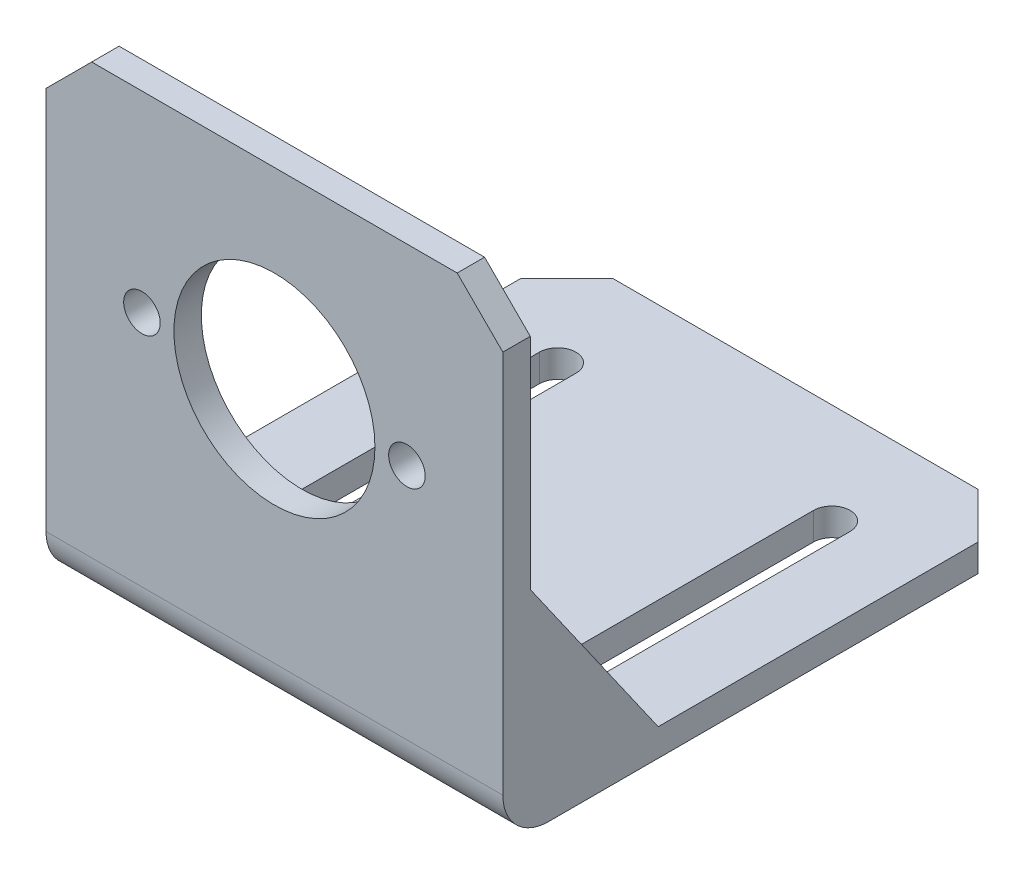
ISO-10303-21;
HEADER;
FILE_DESCRIPTION(('STEP AP214'),'2;1');
FILE_NAME('part.step','',(''),(''),'','','');
FILE_SCHEMA(('AUTOMOTIVE_DESIGN { 1 0 10303 214 1 1 1 1 }'));
ENDSEC;
DATA;
#1=APPLICATION_CONTEXT('core data for automotive mechanical design processes');
#2=APPLICATION_PROTOCOL_DEFINITION('international standard','automotive_design',2000,#1);
#3=PRODUCT_CONTEXT('',#1,'mechanical');
#4=PRODUCT('Part','Part','',(#3));
#5=PRODUCT_RELATED_PRODUCT_CATEGORY('part','',(#4));
#6=PRODUCT_DEFINITION_FORMATION('','',#4);
#7=PRODUCT_DEFINITION_CONTEXT('part definition',#1,'design');
#8=PRODUCT_DEFINITION('design','',#6,#7);
#9=PRODUCT_DEFINITION_SHAPE('','',#8);
#10=(LENGTH_UNIT() NAMED_UNIT(*) SI_UNIT(.MILLI.,.METRE.));
#11=(NAMED_UNIT(*) PLANE_ANGLE_UNIT() SI_UNIT($,.RADIAN.));
#12=(NAMED_UNIT(*) SI_UNIT($,.STERADIAN.) SOLID_ANGLE_UNIT());
#13=UNCERTAINTY_MEASURE_WITH_UNIT(LENGTH_MEASURE(1.E-05),#10,'distance_accuracy_value','');
#14=(GEOMETRIC_REPRESENTATION_CONTEXT(3) GLOBAL_UNCERTAINTY_ASSIGNED_CONTEXT((#13)) GLOBAL_UNIT_ASSIGNED_CONTEXT((#10,
#11,#12)) REPRESENTATION_CONTEXT('',''));
#15=CARTESIAN_POINT('',(0.,0.,0.));
#16=DIRECTION('',(0.,0.,1.));
#17=DIRECTION('',(1.,0.,0.));
#18=AXIS2_PLACEMENT_3D('',#15,#16,#17);
#19=CARTESIAN_POINT('',(-49.4131112314674,-3.,0.));
#20=DIRECTION('',(0.,0.573462344363328,-0.81923192051904));
#21=DIRECTION('',(0.,0.81923192051904,0.573462344363328));
#22=AXIS2_PLACEMENT_3D('',#19,#20,#21);
#23=PLANE('',#22);
#24=DIRECTION('',(1.,0.,0.));
#25=VECTOR('',#24,1.);
#26=CARTESIAN_POINT('',(-49.4131112314674,-3.,0.));
#27=LINE('',#26,#25);
#28=CARTESIAN_POINT('',(-25.,-3.,0.));
#29=VERTEX_POINT('',#28);
#30=CARTESIAN_POINT('',(-22.,-3.,0.));
#31=VERTEX_POINT('',#30);
#32=EDGE_CURVE('E222',#29,#31,#27,.T.);
#33=ORIENTED_EDGE('',*,*,#32,.T.);
#34=DIRECTION('',(0.,0.819231920519041,0.573462344363328));
#35=VECTOR('',#34,1.);
#36=CARTESIAN_POINT('',(-22.,-3.,0.));
#37=LINE('',#36,#35);
#38=CARTESIAN_POINT('',(-22.,-23.,-14.));
#39=VERTEX_POINT('',#38);
#40=EDGE_CURVE('E197',#39,#31,#37,.T.);
#41=ORIENTED_EDGE('',*,*,#40,.F.);
#42=DIRECTION('',(1.,0.,0.));
#43=VECTOR('',#42,1.);
#44=CARTESIAN_POINT('',(-49.4131112314674,-23.,-14.));
#45=LINE('',#44,#43);
#46=CARTESIAN_POINT('',(-25.,-23.,-14.));
#47=VERTEX_POINT('',#46);
#48=EDGE_CURVE('E204',#47,#39,#45,.T.);
#49=ORIENTED_EDGE('',*,*,#48,.F.);
#50=DIRECTION('',(0.,-0.81923192051904,-0.573462344363328));
#51=VECTOR('',#50,1.);
#52=CARTESIAN_POINT('',(-25.,-3.,0.));
#53=LINE('',#52,#51);
#54=EDGE_CURVE('E224',#29,#47,#53,.T.);
#55=ORIENTED_EDGE('',*,*,#54,.F.);
#56=EDGE_LOOP('',(#33,#41,#49,#55));
#57=FACE_BOUND('',#56,.T.);
#58=ADVANCED_FACE('F33',(#57),#23,.T.);
#59=CARTESIAN_POINT('',(0.,0.,0.));
#60=DIRECTION('',(0.,0.,1.));
#61=DIRECTION('',(1.,0.,0.));
#62=AXIS2_PLACEMENT_3D('',#59,#60,#61);
#63=PLANE('',#62);
#64=CARTESIAN_POINT('',(0.,5.,0.));
#65=DIRECTION('',(0.,0.,1.));
#66=DIRECTION('',(1.,0.,0.));
#67=AXIS2_PLACEMENT_3D('',#64,#65,#66);
#68=CIRCLE('',#67,11.);
#69=CARTESIAN_POINT('',(11.,5.,0.));
#70=VERTEX_POINT('',#69);
#71=EDGE_CURVE('E284',#70,#70,#68,.T.);
#72=ORIENTED_EDGE('',*,*,#71,.T.);
#73=EDGE_LOOP('',(#72));
#74=FACE_BOUND('',#73,.T.);
#75=CARTESIAN_POINT('',(14.5,5.,0.));
#76=DIRECTION('',(0.,0.,1.));
#77=DIRECTION('',(1.,0.,0.));
#78=AXIS2_PLACEMENT_3D('',#75,#76,#77);
#79=CIRCLE('',#78,2.);
#80=CARTESIAN_POINT('',(16.5,5.,0.));
#81=VERTEX_POINT('',#80);
#82=EDGE_CURVE('E278',#81,#81,#79,.T.);
#83=ORIENTED_EDGE('',*,*,#82,.T.);
#84=EDGE_LOOP('',(#83));
#85=FACE_BOUND('',#84,.T.);
#86=CARTESIAN_POINT('',(-14.5,5.,0.));
#87=DIRECTION('',(0.,0.,1.));
#88=DIRECTION('',(1.,0.,0.));
#89=AXIS2_PLACEMENT_3D('',#86,#87,#88);
#90=CIRCLE('',#89,2.);
#91=CARTESIAN_POINT('',(-12.5,5.,0.));
#92=VERTEX_POINT('',#91);
#93=EDGE_CURVE('E273',#92,#92,#90,.T.);
#94=ORIENTED_EDGE('',*,*,#93,.T.);
#95=EDGE_LOOP('',(#94));
#96=FACE_BOUND('',#95,.T.);
#97=DIRECTION('',(0.,1.,0.));
#98=VECTOR('',#97,1.);
#99=CARTESIAN_POINT('',(25.,26.,0.));
#100=LINE('',#99,#98);
#101=CARTESIAN_POINT('',(25.,-3.,0.));
#102=VERTEX_POINT('',#101);
#103=CARTESIAN_POINT('',(25.,21.,0.));
#104=VERTEX_POINT('',#103);
#105=EDGE_CURVE('E311',#102,#104,#100,.T.);
#106=ORIENTED_EDGE('',*,*,#105,.F.);
#107=CARTESIAN_POINT('',(22.,-3.,0.));
#108=VERTEX_POINT('',#107);
#109=EDGE_CURVE('E225',#108,#102,#27,.T.);
#110=ORIENTED_EDGE('',*,*,#109,.F.);
#111=DIRECTION('',(0.,-1.,0.));
#112=VECTOR('',#111,1.);
#113=CARTESIAN_POINT('',(22.,-23.,0.));
#114=LINE('',#113,#112);
#115=CARTESIAN_POINT('',(22.,-23.,0.));
#116=VERTEX_POINT('',#115);
#117=EDGE_CURVE('E193',#108,#116,#114,.T.);
#118=ORIENTED_EDGE('',*,*,#117,.T.);
#119=DIRECTION('',(1.,0.,0.));
#120=VECTOR('',#119,1.);
#121=CARTESIAN_POINT('',(-22.,-23.,0.));
#122=LINE('',#121,#120);
#123=CARTESIAN_POINT('',(-22.,-23.,0.));
#124=VERTEX_POINT('',#123);
#125=EDGE_CURVE('E185',#124,#116,#122,.T.);
#126=ORIENTED_EDGE('',*,*,#125,.F.);
#127=DIRECTION('',(0.,-1.,0.));
#128=VECTOR('',#127,1.);
#129=CARTESIAN_POINT('',(-22.,-23.,0.));
#130=LINE('',#129,#128);
#131=EDGE_CURVE('E190',#31,#124,#130,.T.);
#132=ORIENTED_EDGE('',*,*,#131,.F.);
#133=ORIENTED_EDGE('',*,*,#32,.F.);
#134=DIRECTION('',(0.,-1.,0.));
#135=VECTOR('',#134,1.);
#136=CARTESIAN_POINT('',(-25.,26.,0.));
#137=LINE('',#136,#135);
#138=CARTESIAN_POINT('',(-25.,21.,0.));
#139=VERTEX_POINT('',#138);
#140=EDGE_CURVE('E298',#139,#29,#137,.T.);
#141=ORIENTED_EDGE('',*,*,#140,.F.);
#142=DIRECTION('',(-0.707106781186549,-0.707106781186547,0.));
#143=VECTOR('',#142,1.);
#144=CARTESIAN_POINT('',(-25.,21.,0.));
#145=LINE('',#144,#143);
#146=CARTESIAN_POINT('',(-20.,26.,0.));
#147=VERTEX_POINT('',#146);
#148=EDGE_CURVE('E324',#139,#147,#145,.F.);
#149=ORIENTED_EDGE('',*,*,#148,.T.);
#150=DIRECTION('',(-1.,0.,0.));
#151=VECTOR('',#150,1.);
#152=CARTESIAN_POINT('',(-25.,26.,0.));
#153=LINE('',#152,#151);
#154=CARTESIAN_POINT('',(20.,26.,0.));
#155=VERTEX_POINT('',#154);
#156=EDGE_CURVE('E303',#155,#147,#153,.T.);
#157=ORIENTED_EDGE('',*,*,#156,.F.);
#158=DIRECTION('',(-0.707106781186547,0.707106781186549,0.));
#159=VECTOR('',#158,1.);
#160=CARTESIAN_POINT('',(20.,26.,0.));
#161=LINE('',#160,#159);
#162=EDGE_CURVE('E321',#155,#104,#161,.F.);
#163=ORIENTED_EDGE('',*,*,#162,.T.);
#164=EDGE_LOOP('',(#106,#110,#118,#126,#132,#133,#141,#149,#157,#163));
#165=FACE_BOUND('',#164,.T.);
#166=ADVANCED_FACE('F188',(#74,#85,#96,#165),#63,.F.);
#167=CARTESIAN_POINT('',(-25.,26.,3.));
#168=DIRECTION('',(1.,0.,0.));
#169=DIRECTION('',(0.,1.,0.));
#170=AXIS2_PLACEMENT_3D('',#167,#168,#169);
#171=PLANE('',#170);
#172=DIRECTION('',(0.,0.,-1.));
#173=VECTOR('',#172,1.);
#174=CARTESIAN_POINT('',(-25.,-26.,3.));
#175=LINE('',#174,#173);
#176=CARTESIAN_POINT('',(-25.,-26.,-2.));
#177=VERTEX_POINT('',#176);
#178=CARTESIAN_POINT('',(-25.,-26.,-49.));
#179=VERTEX_POINT('',#178);
#180=EDGE_CURVE('E316',#177,#179,#175,.T.);
#181=ORIENTED_EDGE('',*,*,#180,.F.);
#182=CARTESIAN_POINT('',(-25.,-21.,-2.));
#183=DIRECTION('',(1.,0.,0.));
#184=DIRECTION('',(0.,1.,0.));
#185=AXIS2_PLACEMENT_3D('',#182,#183,#184);
#186=CIRCLE('',#185,5.);
#187=CARTESIAN_POINT('',(-25.,-21.,3.));
#188=VERTEX_POINT('',#187);
#189=EDGE_CURVE('E11',#177,#188,#186,.F.);
#190=ORIENTED_EDGE('',*,*,#189,.T.);
#191=DIRECTION('',(0.,-1.,0.));
#192=VECTOR('',#191,1.);
#193=CARTESIAN_POINT('',(-25.,26.,3.));
#194=LINE('',#193,#192);
#195=CARTESIAN_POINT('',(-25.,21.,3.));
#196=VERTEX_POINT('',#195);
#197=EDGE_CURVE('E299',#196,#188,#194,.T.);
#198=ORIENTED_EDGE('',*,*,#197,.F.);
#199=DIRECTION('',(0.,0.,-1.));
#200=VECTOR('',#199,1.);
#201=CARTESIAN_POINT('',(-25.,21.,3.));
#202=LINE('',#201,#200);
#203=EDGE_CURVE('E318',#196,#139,#202,.T.);
#204=ORIENTED_EDGE('',*,*,#203,.T.);
#205=ORIENTED_EDGE('',*,*,#140,.T.);
#206=ORIENTED_EDGE('',*,*,#54,.T.);
#207=DIRECTION('',(0.,0.,1.));
#208=VECTOR('',#207,1.);
#209=CARTESIAN_POINT('',(-25.,-23.,-54.));
#210=LINE('',#209,#208);
#211=CARTESIAN_POINT('',(-25.,-23.,-49.));
#212=VERTEX_POINT('',#211);
#213=EDGE_CURVE('E296',#212,#47,#210,.T.);
#214=ORIENTED_EDGE('',*,*,#213,.F.);
#215=DIRECTION('',(0.,-1.,0.));
#216=VECTOR('',#215,1.);
#217=CARTESIAN_POINT('',(-25.,26.,-49.));
#218=LINE('',#217,#216);
#219=EDGE_CURVE('E348',#212,#179,#218,.T.);
#220=ORIENTED_EDGE('',*,*,#219,.T.);
#221=EDGE_LOOP('',(#181,#190,#198,#204,#205,#206,#214,#220));
#222=FACE_BOUND('',#221,.T.);
#223=ADVANCED_FACE('F401',(#222),#171,.F.);
#224=CARTESIAN_POINT('',(-25.,-26.,3.));
#225=DIRECTION('',(0.,1.,0.));
#226=DIRECTION('',(0.,0.,1.));
#227=AXIS2_PLACEMENT_3D('',#224,#225,#226);
#228=PLANE('',#227);
#229=DIRECTION('',(0.,0.,1.));
#230=VECTOR('',#229,1.);
#231=CARTESIAN_POINT('',(-13.,-26.,-43.));
#232=LINE('',#231,#230);
#233=CARTESIAN_POINT('',(-13.,-26.,-43.));
#234=VERTEX_POINT('',#233);
#235=CARTESIAN_POINT('',(-13.,-26.,-13.));
#236=VERTEX_POINT('',#235);
#237=EDGE_CURVE('E231',#234,#236,#232,.T.);
#238=ORIENTED_EDGE('',*,*,#237,.F.);
#239=CARTESIAN_POINT('',(-15.,-26.,-43.));
#240=DIRECTION('',(0.,-1.,0.));
#241=DIRECTION('',(0.,0.,1.));
#242=AXIS2_PLACEMENT_3D('',#239,#240,#241);
#243=CIRCLE('',#242,2.);
#244=CARTESIAN_POINT('',(-17.,-26.,-43.));
#245=VERTEX_POINT('',#244);
#246=EDGE_CURVE('E229',#245,#234,#243,.T.);
#247=ORIENTED_EDGE('',*,*,#246,.F.);
#248=DIRECTION('',(0.,0.,-1.));
#249=VECTOR('',#248,1.);
#250=CARTESIAN_POINT('',(-17.,-26.,-43.));
#251=LINE('',#250,#249);
#252=CARTESIAN_POINT('',(-17.,-26.,-13.));
#253=VERTEX_POINT('',#252);
#254=EDGE_CURVE('E237',#253,#245,#251,.T.);
#255=ORIENTED_EDGE('',*,*,#254,.F.);
#256=CARTESIAN_POINT('',(-15.,-26.,-13.));
#257=DIRECTION('',(0.,-1.,0.));
#258=DIRECTION('',(0.,0.,1.));
#259=AXIS2_PLACEMENT_3D('',#256,#257,#258);
#260=CIRCLE('',#259,2.);
#261=EDGE_CURVE('E234',#236,#253,#260,.T.);
#262=ORIENTED_EDGE('',*,*,#261,.F.);
#263=EDGE_LOOP('',(#238,#247,#255,#262));
#264=FACE_BOUND('',#263,.T.);
#265=DIRECTION('',(0.,0.,1.));
#266=VECTOR('',#265,1.);
#267=CARTESIAN_POINT('',(17.,-26.,-43.));
#268=LINE('',#267,#266);
#269=CARTESIAN_POINT('',(17.,-26.,-43.));
#270=VERTEX_POINT('',#269);
#271=CARTESIAN_POINT('',(17.,-26.,-13.));
#272=VERTEX_POINT('',#271);
#273=EDGE_CURVE('E251',#270,#272,#268,.T.);
#274=ORIENTED_EDGE('',*,*,#273,.F.);
#275=CARTESIAN_POINT('',(15.,-26.,-43.));
#276=DIRECTION('',(0.,-1.,0.));
#277=DIRECTION('',(0.,0.,-1.));
#278=AXIS2_PLACEMENT_3D('',#275,#276,#277);
#279=CIRCLE('',#278,2.);
#280=CARTESIAN_POINT('',(13.,-26.,-43.));
#281=VERTEX_POINT('',#280);
#282=EDGE_CURVE('E243',#281,#270,#279,.T.);
#283=ORIENTED_EDGE('',*,*,#282,.F.);
#284=DIRECTION('',(0.,0.,-1.));
#285=VECTOR('',#284,1.);
#286=CARTESIAN_POINT('',(13.,-26.,-43.));
#287=LINE('',#286,#285);
#288=CARTESIAN_POINT('',(13.,-26.,-13.));
#289=VERTEX_POINT('',#288);
#290=EDGE_CURVE('E257',#289,#281,#287,.T.);
#291=ORIENTED_EDGE('',*,*,#290,.F.);
#292=CARTESIAN_POINT('',(15.,-26.,-13.));
#293=DIRECTION('',(0.,-1.,0.));
#294=DIRECTION('',(0.,0.,-1.));
#295=AXIS2_PLACEMENT_3D('',#292,#293,#294);
#296=CIRCLE('',#295,2.);
#297=EDGE_CURVE('E254',#272,#289,#296,.T.);
#298=ORIENTED_EDGE('',*,*,#297,.F.);
#299=EDGE_LOOP('',(#274,#283,#291,#298));
#300=FACE_BOUND('',#299,.T.);
#301=DIRECTION('',(0.,0.,-1.));
#302=VECTOR('',#301,1.);
#303=CARTESIAN_POINT('',(25.,-26.,3.));
#304=LINE('',#303,#302);
#305=CARTESIAN_POINT('',(25.,-26.,-2.));
#306=VERTEX_POINT('',#305);
#307=CARTESIAN_POINT('',(25.,-26.,-49.));
#308=VERTEX_POINT('',#307);
#309=EDGE_CURVE('E308',#306,#308,#304,.T.);
#310=ORIENTED_EDGE('',*,*,#309,.F.);
#311=DIRECTION('',(1.,0.,0.));
#312=VECTOR('',#311,1.);
#313=CARTESIAN_POINT('',(-25.,-26.,-2.));
#314=LINE('',#313,#312);
#315=EDGE_CURVE('E41',#306,#177,#314,.F.);
#316=ORIENTED_EDGE('',*,*,#315,.T.);
#317=ORIENTED_EDGE('',*,*,#180,.T.);
#318=DIRECTION('',(-0.707106781186546,0.,0.707106781186549));
#319=VECTOR('',#318,1.);
#320=CARTESIAN_POINT('',(-20.,-26.,-54.));
#321=LINE('',#320,#319);
#322=CARTESIAN_POINT('',(-20.,-26.,-54.));
#323=VERTEX_POINT('',#322);
#324=EDGE_CURVE('E354',#179,#323,#321,.F.);
#325=ORIENTED_EDGE('',*,*,#324,.T.);
#326=DIRECTION('',(-1.,0.,0.));
#327=VECTOR('',#326,1.);
#328=CARTESIAN_POINT('',(25.,-26.,-54.));
#329=LINE('',#328,#327);
#330=CARTESIAN_POINT('',(20.,-26.,-54.));
#331=VERTEX_POINT('',#330);
#332=EDGE_CURVE('E287',#331,#323,#329,.T.);
#333=ORIENTED_EDGE('',*,*,#332,.F.);
#334=DIRECTION('',(-0.707106781186547,0.,-0.707106781186549));
#335=VECTOR('',#334,1.);
#336=CARTESIAN_POINT('',(20.,-26.,-54.));
#337=LINE('',#336,#335);
#338=EDGE_CURVE('E351',#331,#308,#337,.F.);
#339=ORIENTED_EDGE('',*,*,#338,.T.);
#340=EDGE_LOOP('',(#310,#316,#317,#325,#333,#339));
#341=FACE_BOUND('',#340,.T.);
#342=ADVANCED_FACE('F446',(#264,#300,#341),#228,.F.);
#343=CARTESIAN_POINT('',(25.,26.,3.));
#344=DIRECTION('',(-1.,0.,0.));
#345=DIRECTION('',(0.,0.,1.));
#346=AXIS2_PLACEMENT_3D('',#343,#344,#345);
#347=PLANE('',#346);
#348=DIRECTION('',(0.,1.,0.));
#349=VECTOR('',#348,1.);
#350=CARTESIAN_POINT('',(25.,26.,3.));
#351=LINE('',#350,#349);
#352=CARTESIAN_POINT('',(25.,-21.,3.));
#353=VERTEX_POINT('',#352);
#354=CARTESIAN_POINT('',(25.,21.,3.));
#355=VERTEX_POINT('',#354);
#356=EDGE_CURVE('E302',#353,#355,#351,.T.);
#357=ORIENTED_EDGE('',*,*,#356,.F.);
#358=CARTESIAN_POINT('',(25.,-21.,-2.));
#359=DIRECTION('',(-1.,0.,0.));
#360=DIRECTION('',(0.,0.,1.));
#361=AXIS2_PLACEMENT_3D('',#358,#359,#360);
#362=CIRCLE('',#361,5.);
#363=EDGE_CURVE('E55',#353,#306,#362,.F.);
#364=ORIENTED_EDGE('',*,*,#363,.T.);
#365=ORIENTED_EDGE('',*,*,#309,.T.);
#366=DIRECTION('',(0.,1.,0.));
#367=VECTOR('',#366,1.);
#368=CARTESIAN_POINT('',(25.,26.,-49.));
#369=LINE('',#368,#367);
#370=CARTESIAN_POINT('',(25.,-23.,-49.));
#371=VERTEX_POINT('',#370);
#372=EDGE_CURVE('E356',#308,#371,#369,.T.);
#373=ORIENTED_EDGE('',*,*,#372,.T.);
#374=DIRECTION('',(0.,0.,1.));
#375=VECTOR('',#374,1.);
#376=CARTESIAN_POINT('',(25.,-23.,-54.));
#377=LINE('',#376,#375);
#378=CARTESIAN_POINT('',(25.,-23.,-14.));
#379=VERTEX_POINT('',#378);
#380=EDGE_CURVE('E293',#371,#379,#377,.T.);
#381=ORIENTED_EDGE('',*,*,#380,.T.);
#382=DIRECTION('',(0.,0.81923192051904,0.573462344363328));
#383=VECTOR('',#382,1.);
#384=CARTESIAN_POINT('',(25.,-3.,0.));
#385=LINE('',#384,#383);
#386=EDGE_CURVE('E196',#379,#102,#385,.T.);
#387=ORIENTED_EDGE('',*,*,#386,.T.);
#388=ORIENTED_EDGE('',*,*,#105,.T.);
#389=DIRECTION('',(0.,0.,1.));
#390=VECTOR('',#389,1.);
#391=CARTESIAN_POINT('',(25.,21.,3.));
#392=LINE('',#391,#390);
#393=EDGE_CURVE('E335',#104,#355,#392,.T.);
#394=ORIENTED_EDGE('',*,*,#393,.T.);
#395=EDGE_LOOP('',(#357,#364,#365,#373,#381,#387,#388,#394));
#396=FACE_BOUND('',#395,.T.);
#397=ADVANCED_FACE('F385',(#396),#347,.F.);
#398=CARTESIAN_POINT('',(-25.,26.,3.));
#399=DIRECTION('',(0.,-1.,0.));
#400=DIRECTION('',(0.,0.,-1.));
#401=AXIS2_PLACEMENT_3D('',#398,#399,#400);
#402=PLANE('',#401);
#403=ORIENTED_EDGE('',*,*,#156,.T.);
#404=DIRECTION('',(0.,0.,1.));
#405=VECTOR('',#404,1.);
#406=CARTESIAN_POINT('',(-20.,26.,3.));
#407=LINE('',#406,#405);
#408=CARTESIAN_POINT('',(-20.,26.,3.));
#409=VERTEX_POINT('',#408);
#410=EDGE_CURVE('E329',#147,#409,#407,.T.);
#411=ORIENTED_EDGE('',*,*,#410,.T.);
#412=DIRECTION('',(-1.,0.,0.));
#413=VECTOR('',#412,1.);
#414=CARTESIAN_POINT('',(-25.,26.,3.));
#415=LINE('',#414,#413);
#416=CARTESIAN_POINT('',(20.,26.,3.));
#417=VERTEX_POINT('',#416);
#418=EDGE_CURVE('E305',#417,#409,#415,.T.);
#419=ORIENTED_EDGE('',*,*,#418,.F.);
#420=DIRECTION('',(0.,0.,-1.));
#421=VECTOR('',#420,1.);
#422=CARTESIAN_POINT('',(20.,26.,3.));
#423=LINE('',#422,#421);
#424=EDGE_CURVE('E326',#417,#155,#423,.T.);
#425=ORIENTED_EDGE('',*,*,#424,.T.);
#426=EDGE_LOOP('',(#403,#411,#419,#425));
#427=FACE_BOUND('',#426,.T.);
#428=ADVANCED_FACE('F394',(#427),#402,.F.);
#429=CARTESIAN_POINT('',(0.,0.,3.));
#430=DIRECTION('',(0.,0.,1.));
#431=DIRECTION('',(1.,0.,0.));
#432=AXIS2_PLACEMENT_3D('',#429,#430,#431);
#433=PLANE('',#432);
#434=CARTESIAN_POINT('',(14.5,5.,3.));
#435=DIRECTION('',(0.,0.,1.));
#436=DIRECTION('',(1.,0.,0.));
#437=AXIS2_PLACEMENT_3D('',#434,#435,#436);
#438=CIRCLE('',#437,2.);
#439=CARTESIAN_POINT('',(16.5,5.,3.));
#440=VERTEX_POINT('',#439);
#441=EDGE_CURVE('E270',#440,#440,#438,.T.);
#442=ORIENTED_EDGE('',*,*,#441,.F.);
#443=EDGE_LOOP('',(#442));
#444=FACE_BOUND('',#443,.T.);
#445=CARTESIAN_POINT('',(-14.5,5.,3.));
#446=DIRECTION('',(0.,0.,1.));
#447=DIRECTION('',(-1.,0.,0.));
#448=AXIS2_PLACEMENT_3D('',#445,#446,#447);
#449=CIRCLE('',#448,2.);
#450=CARTESIAN_POINT('',(-12.5,5.,3.));
#451=VERTEX_POINT('',#450);
#452=EDGE_CURVE('E263',#451,#451,#449,.T.);
#453=ORIENTED_EDGE('',*,*,#452,.F.);
#454=EDGE_LOOP('',(#453));
#455=FACE_BOUND('',#454,.T.);
#456=CARTESIAN_POINT('',(0.,5.,3.));
#457=DIRECTION('',(0.,0.,1.));
#458=DIRECTION('',(1.,0.,0.));
#459=AXIS2_PLACEMENT_3D('',#456,#457,#458);
#460=CIRCLE('',#459,11.);
#461=CARTESIAN_POINT('',(11.,5.,3.));
#462=VERTEX_POINT('',#461);
#463=EDGE_CURVE('E281',#462,#462,#460,.T.);
#464=ORIENTED_EDGE('',*,*,#463,.F.);
#465=EDGE_LOOP('',(#464));
#466=FACE_BOUND('',#465,.T.);
#467=ORIENTED_EDGE('',*,*,#197,.T.);
#468=DIRECTION('',(1.,0.,0.));
#469=VECTOR('',#468,1.);
#470=CARTESIAN_POINT('',(25.,-21.,3.));
#471=LINE('',#470,#469);
#472=EDGE_CURVE('E376',#188,#353,#471,.T.);
#473=ORIENTED_EDGE('',*,*,#472,.T.);
#474=ORIENTED_EDGE('',*,*,#356,.T.);
#475=DIRECTION('',(0.707106781186547,-0.707106781186549,0.));
#476=VECTOR('',#475,1.);
#477=CARTESIAN_POINT('',(23.,23.,3.));
#478=LINE('',#477,#476);
#479=EDGE_CURVE('E331',#355,#417,#478,.F.);
#480=ORIENTED_EDGE('',*,*,#479,.T.);
#481=ORIENTED_EDGE('',*,*,#418,.T.);
#482=DIRECTION('',(0.707106781186549,0.707106781186547,0.));
#483=VECTOR('',#482,1.);
#484=CARTESIAN_POINT('',(-23.,23.,3.));
#485=LINE('',#484,#483);
#486=EDGE_CURVE('E333',#409,#196,#485,.F.);
#487=ORIENTED_EDGE('',*,*,#486,.T.);
#488=EDGE_LOOP('',(#467,#473,#474,#480,#481,#487));
#489=FACE_BOUND('',#488,.T.);
#490=ADVANCED_FACE('F381',(#444,#455,#466,#489),#433,.T.);
#491=CARTESIAN_POINT('',(25.,-23.,-54.));
#492=DIRECTION('',(0.,-1.,0.));
#493=DIRECTION('',(1.,0.,0.));
#494=AXIS2_PLACEMENT_3D('',#491,#492,#493);
#495=PLANE('',#494);
#496=DIRECTION('',(0.,0.,-1.));
#497=VECTOR('',#496,1.);
#498=CARTESIAN_POINT('',(22.,-23.,-14.));
#499=LINE('',#498,#497);
#500=CARTESIAN_POINT('',(22.,-23.,-14.));
#501=VERTEX_POINT('',#500);
#502=EDGE_CURVE('E213',#116,#501,#499,.T.);
#503=ORIENTED_EDGE('',*,*,#502,.T.);
#504=EDGE_CURVE('E221',#501,#379,#45,.T.);
#505=ORIENTED_EDGE('',*,*,#504,.T.);
#506=ORIENTED_EDGE('',*,*,#380,.F.);
#507=DIRECTION('',(0.707106781186547,0.,0.707106781186549));
#508=VECTOR('',#507,1.);
#509=CARTESIAN_POINT('',(20.,-23.,-54.));
#510=LINE('',#509,#508);
#511=CARTESIAN_POINT('',(20.,-23.,-54.));
#512=VERTEX_POINT('',#511);
#513=EDGE_CURVE('E344',#371,#512,#510,.F.);
#514=ORIENTED_EDGE('',*,*,#513,.T.);
#515=DIRECTION('',(1.,0.,0.));
#516=VECTOR('',#515,1.);
#517=CARTESIAN_POINT('',(25.,-23.,-54.));
#518=LINE('',#517,#516);
#519=CARTESIAN_POINT('',(-20.,-23.,-54.));
#520=VERTEX_POINT('',#519);
#521=EDGE_CURVE('E290',#520,#512,#518,.T.);
#522=ORIENTED_EDGE('',*,*,#521,.F.);
#523=DIRECTION('',(0.707106781186546,0.,-0.707106781186549));
#524=VECTOR('',#523,1.);
#525=CARTESIAN_POINT('',(-20.,-23.,-54.));
#526=LINE('',#525,#524);
#527=EDGE_CURVE('E346',#520,#212,#526,.F.);
#528=ORIENTED_EDGE('',*,*,#527,.T.);
#529=ORIENTED_EDGE('',*,*,#213,.T.);
#530=ORIENTED_EDGE('',*,*,#48,.T.);
#531=DIRECTION('',(0.,0.,-1.));
#532=VECTOR('',#531,1.);
#533=CARTESIAN_POINT('',(-22.,-23.,-14.));
#534=LINE('',#533,#532);
#535=EDGE_CURVE('E200',#124,#39,#534,.T.);
#536=ORIENTED_EDGE('',*,*,#535,.F.);
#537=ORIENTED_EDGE('',*,*,#125,.T.);
#538=EDGE_LOOP('',(#503,#505,#506,#514,#522,#528,#529,#530,#536,#537));
#539=FACE_BOUND('',#538,.T.);
#540=DIRECTION('',(0.,0.,-1.));
#541=VECTOR('',#540,1.);
#542=CARTESIAN_POINT('',(13.,-23.,-54.));
#543=LINE('',#542,#541);
#544=CARTESIAN_POINT('',(13.,-23.,-13.));
#545=VERTEX_POINT('',#544);
#546=CARTESIAN_POINT('',(13.,-23.,-43.));
#547=VERTEX_POINT('',#546);
#548=EDGE_CURVE('E362',#545,#547,#543,.T.);
#549=ORIENTED_EDGE('',*,*,#548,.T.);
#550=CARTESIAN_POINT('',(15.,-23.,-43.));
#551=DIRECTION('',(0.,-1.,0.));
#552=DIRECTION('',(1.,0.,0.));
#553=AXIS2_PLACEMENT_3D('',#550,#551,#552);
#554=CIRCLE('',#553,2.);
#555=CARTESIAN_POINT('',(17.,-23.,-43.));
#556=VERTEX_POINT('',#555);
#557=EDGE_CURVE('E364',#547,#556,#554,.T.);
#558=ORIENTED_EDGE('',*,*,#557,.T.);
#559=DIRECTION('',(0.,0.,1.));
#560=VECTOR('',#559,1.);
#561=CARTESIAN_POINT('',(17.,-23.,-54.));
#562=LINE('',#561,#560);
#563=CARTESIAN_POINT('',(17.,-23.,-13.));
#564=VERTEX_POINT('',#563);
#565=EDGE_CURVE('E358',#556,#564,#562,.T.);
#566=ORIENTED_EDGE('',*,*,#565,.T.);
#567=CARTESIAN_POINT('',(15.,-23.,-13.));
#568=DIRECTION('',(0.,-1.,0.));
#569=DIRECTION('',(1.,0.,0.));
#570=AXIS2_PLACEMENT_3D('',#567,#568,#569);
#571=CIRCLE('',#570,2.);
#572=EDGE_CURVE('E360',#564,#545,#571,.T.);
#573=ORIENTED_EDGE('',*,*,#572,.T.);
#574=EDGE_LOOP('',(#549,#558,#566,#573));
#575=FACE_BOUND('',#574,.T.);
#576=DIRECTION('',(0.,0.,1.));
#577=VECTOR('',#576,1.);
#578=CARTESIAN_POINT('',(-13.,-23.,-54.));
#579=LINE('',#578,#577);
#580=CARTESIAN_POINT('',(-13.,-23.,-43.));
#581=VERTEX_POINT('',#580);
#582=CARTESIAN_POINT('',(-13.,-23.,-13.));
#583=VERTEX_POINT('',#582);
#584=EDGE_CURVE('E367',#581,#583,#579,.T.);
#585=ORIENTED_EDGE('',*,*,#584,.T.);
#586=CARTESIAN_POINT('',(-15.,-23.,-13.));
#587=DIRECTION('',(0.,-1.,0.));
#588=DIRECTION('',(1.,0.,0.));
#589=AXIS2_PLACEMENT_3D('',#586,#587,#588);
#590=CIRCLE('',#589,2.);
#591=CARTESIAN_POINT('',(-17.,-23.,-13.));
#592=VERTEX_POINT('',#591);
#593=EDGE_CURVE('E369',#583,#592,#590,.T.);
#594=ORIENTED_EDGE('',*,*,#593,.T.);
#595=DIRECTION('',(0.,0.,-1.));
#596=VECTOR('',#595,1.);
#597=CARTESIAN_POINT('',(-17.,-23.,-54.));
#598=LINE('',#597,#596);
#599=CARTESIAN_POINT('',(-17.,-23.,-43.));
#600=VERTEX_POINT('',#599);
#601=EDGE_CURVE('E371',#592,#600,#598,.T.);
#602=ORIENTED_EDGE('',*,*,#601,.T.);
#603=CARTESIAN_POINT('',(-15.,-23.,-43.));
#604=DIRECTION('',(0.,-1.,0.));
#605=DIRECTION('',(1.,0.,0.));
#606=AXIS2_PLACEMENT_3D('',#603,#604,#605);
#607=CIRCLE('',#606,2.);
#608=EDGE_CURVE('E373',#600,#581,#607,.T.);
#609=ORIENTED_EDGE('',*,*,#608,.T.);
#610=EDGE_LOOP('',(#585,#594,#602,#609));
#611=FACE_BOUND('',#610,.T.);
#612=ADVANCED_FACE('F201',(#539,#575,#611),#495,.F.);
#613=CARTESIAN_POINT('',(0.,0.,-54.));
#614=DIRECTION('',(0.,0.,1.));
#615=DIRECTION('',(1.,0.,0.));
#616=AXIS2_PLACEMENT_3D('',#613,#614,#615);
#617=PLANE('',#616);
#618=ORIENTED_EDGE('',*,*,#332,.T.);
#619=DIRECTION('',(0.,1.,0.));
#620=VECTOR('',#619,1.);
#621=CARTESIAN_POINT('',(-20.,0.,-54.));
#622=LINE('',#621,#620);
#623=EDGE_CURVE('E341',#323,#520,#622,.T.);
#624=ORIENTED_EDGE('',*,*,#623,.T.);
#625=ORIENTED_EDGE('',*,*,#521,.T.);
#626=DIRECTION('',(0.,-1.,0.));
#627=VECTOR('',#626,1.);
#628=CARTESIAN_POINT('',(20.,0.,-54.));
#629=LINE('',#628,#627);
#630=EDGE_CURVE('E338',#512,#331,#629,.T.);
#631=ORIENTED_EDGE('',*,*,#630,.T.);
#632=EDGE_LOOP('',(#618,#624,#625,#631));
#633=FACE_BOUND('',#632,.T.);
#634=ADVANCED_FACE('F444',(#633),#617,.F.);
#635=CARTESIAN_POINT('',(0.,5.,-54.));
#636=DIRECTION('',(0.,0.,1.));
#637=DIRECTION('',(1.,0.,0.));
#638=AXIS2_PLACEMENT_3D('',#635,#636,#637);
#639=CYLINDRICAL_SURFACE('',#638,11.);
#640=CARTESIAN_POINT('',(11.,5.,3.));
#641=CARTESIAN_POINT('',(11.,5.,2.96875));
#642=CARTESIAN_POINT('',(11.,5.,2.9375));
#643=CARTESIAN_POINT('',(11.,5.,2.875));
#644=CARTESIAN_POINT('',(11.,5.,2.84375));
#645=CARTESIAN_POINT('',(11.,5.,2.78125));
#646=CARTESIAN_POINT('',(11.,5.,2.75));
#647=CARTESIAN_POINT('',(11.,5.,2.6875));
#648=CARTESIAN_POINT('',(11.,5.,2.65625));
#649=CARTESIAN_POINT('',(11.,5.,2.59375));
#650=CARTESIAN_POINT('',(11.,5.,2.5625));
#651=CARTESIAN_POINT('',(11.,5.,2.5));
#652=CARTESIAN_POINT('',(11.,5.,2.46875));
#653=CARTESIAN_POINT('',(11.,5.,2.40625));
#654=CARTESIAN_POINT('',(11.,5.,2.375));
#655=CARTESIAN_POINT('',(11.,5.,2.3125));
#656=CARTESIAN_POINT('',(11.,5.,2.28125));
#657=CARTESIAN_POINT('',(11.,5.,2.21875));
#658=CARTESIAN_POINT('',(11.,5.,2.1875));
#659=CARTESIAN_POINT('',(11.,5.,2.125));
#660=CARTESIAN_POINT('',(11.,5.,2.09375));
#661=CARTESIAN_POINT('',(11.,5.,2.03125));
#662=CARTESIAN_POINT('',(11.,5.,2.));
#663=CARTESIAN_POINT('',(11.,5.,1.9375));
#664=CARTESIAN_POINT('',(11.,5.,1.90625));
#665=CARTESIAN_POINT('',(11.,5.,1.84375));
#666=CARTESIAN_POINT('',(11.,5.,1.8125));
#667=CARTESIAN_POINT('',(11.,5.,1.75));
#668=CARTESIAN_POINT('',(11.,5.,1.71875));
#669=CARTESIAN_POINT('',(11.,5.,1.65625));
#670=CARTESIAN_POINT('',(11.,5.,1.625));
#671=CARTESIAN_POINT('',(11.,5.,1.5625));
#672=CARTESIAN_POINT('',(11.,5.,1.53125));
#673=CARTESIAN_POINT('',(11.,5.,1.46875));
#674=CARTESIAN_POINT('',(11.,5.,1.4375));
#675=CARTESIAN_POINT('',(11.,5.,1.375));
#676=CARTESIAN_POINT('',(11.,5.,1.34375));
#677=CARTESIAN_POINT('',(11.,5.,1.28125));
#678=CARTESIAN_POINT('',(11.,5.,1.25));
#679=CARTESIAN_POINT('',(11.,5.,1.1875));
#680=CARTESIAN_POINT('',(11.,5.,1.15625));
#681=CARTESIAN_POINT('',(11.,5.,1.09375));
#682=CARTESIAN_POINT('',(11.,5.,1.0625));
#683=CARTESIAN_POINT('',(11.,5.,0.999999999999999));
#684=CARTESIAN_POINT('',(11.,5.,0.96875));
#685=CARTESIAN_POINT('',(11.,5.,0.906250000000002));
#686=CARTESIAN_POINT('',(11.,5.,0.875000000000003));
#687=CARTESIAN_POINT('',(11.,5.,0.812500000000003));
#688=CARTESIAN_POINT('',(11.,5.,0.781250000000002));
#689=CARTESIAN_POINT('',(11.,5.,0.718749999999999));
#690=CARTESIAN_POINT('',(11.,5.,0.687499999999998));
#691=CARTESIAN_POINT('',(11.,5.,0.624999999999998));
#692=CARTESIAN_POINT('',(11.,5.,0.593749999999999));
#693=CARTESIAN_POINT('',(11.,5.,0.531250000000002));
#694=CARTESIAN_POINT('',(11.,5.,0.500000000000003));
#695=CARTESIAN_POINT('',(11.,5.,0.437500000000003));
#696=CARTESIAN_POINT('',(11.,5.,0.406250000000002));
#697=CARTESIAN_POINT('',(11.,5.,0.343749999999999));
#698=CARTESIAN_POINT('',(11.,5.,0.312499999999998));
#699=CARTESIAN_POINT('',(11.,5.,0.249999999999998));
#700=CARTESIAN_POINT('',(11.,5.,0.218749999999999));
#701=CARTESIAN_POINT('',(11.,5.,0.156250000000001));
#702=CARTESIAN_POINT('',(11.,5.,0.125000000000002));
#703=CARTESIAN_POINT('',(11.,5.,0.0625000000000024));
#704=CARTESIAN_POINT('',(11.,5.,0.0312500000000012));
#705=CARTESIAN_POINT('',(11.,5.,0.));
#706=B_SPLINE_CURVE_WITH_KNOTS('',3,(#640,#641,#642,#643,#644,#645,#646,#647,#648,#649,#650,
#651,#652,#653,#654,#655,#656,#657,#658,#659,#660,#661,#662,#663,#664,#665,#666,#667,#668,#669,
#670,#671,#672,#673,#674,#675,#676,#677,#678,#679,#680,#681,#682,#683,#684,#685,#686,#687,#688,
#689,#690,#691,#692,#693,#694,#695,#696,#697,#698,#699,#700,#701,#702,#703,#704,#705),
.UNSPECIFIED.,.F.,.F.,(4,2,2,2,2,2,2,2,2,2,2,2,2,2,2,2,2,2,2,2,2,2,2,2,2,2,2,2,2,2,2,2,4),(0.,
0.0937500000000036,0.1875,0.281249999999997,0.375,0.468750000000004,0.5625,0.656249999999997,
0.750000000000001,0.843750000000004,0.937500000000001,1.03125,1.125,1.21875,1.3125,1.40625,1.5,
1.59375,1.6875,1.78125,1.875,1.96875000000001,2.0625,2.15625,2.25,2.34375000000001,2.4375,
2.53125,2.625,2.71875000000001,2.8125,2.90625,3.),.UNSPECIFIED.);
#707=EDGE_CURVE('BSEAM480',#462,#70,#706,.T.);
#708=ORIENTED_EDGE('',*,*,#463,.T.);
#709=ORIENTED_EDGE('',*,*,#71,.F.);
#710=ORIENTED_EDGE('',*,*,#707,.T.);
#711=ORIENTED_EDGE('',*,*,#707,.F.);
#712=EDGE_LOOP('',(#708,#710,#709,#711));
#713=FACE_BOUND('',#712,.T.);
#714=ADVANCED_FACE('F480',(#713),#639,.F.);
#715=CARTESIAN_POINT('',(-14.5,5.,-54.));
#716=DIRECTION('',(0.,0.,1.));
#717=DIRECTION('',(1.,0.,0.));
#718=AXIS2_PLACEMENT_3D('',#715,#716,#717);
#719=CYLINDRICAL_SURFACE('',#718,2.);
#720=CARTESIAN_POINT('',(-12.5,5.,3.));
#721=CARTESIAN_POINT('',(-12.5,5.,2.96875));
#722=CARTESIAN_POINT('',(-12.5,5.,2.9375));
#723=CARTESIAN_POINT('',(-12.5,5.,2.875));
#724=CARTESIAN_POINT('',(-12.5,5.,2.84375));
#725=CARTESIAN_POINT('',(-12.5,5.,2.78125));
#726=CARTESIAN_POINT('',(-12.5,5.,2.75));
#727=CARTESIAN_POINT('',(-12.5,5.,2.6875));
#728=CARTESIAN_POINT('',(-12.5,5.,2.65625));
#729=CARTESIAN_POINT('',(-12.5,5.,2.59375));
#730=CARTESIAN_POINT('',(-12.5,5.,2.5625));
#731=CARTESIAN_POINT('',(-12.5,5.,2.5));
#732=CARTESIAN_POINT('',(-12.5,5.,2.46875));
#733=CARTESIAN_POINT('',(-12.5,5.,2.40625));
#734=CARTESIAN_POINT('',(-12.5,5.,2.375));
#735=CARTESIAN_POINT('',(-12.5,5.,2.3125));
#736=CARTESIAN_POINT('',(-12.5,5.,2.28125));
#737=CARTESIAN_POINT('',(-12.5,5.,2.21875));
#738=CARTESIAN_POINT('',(-12.5,5.,2.1875));
#739=CARTESIAN_POINT('',(-12.5,5.,2.125));
#740=CARTESIAN_POINT('',(-12.5,5.,2.09375));
#741=CARTESIAN_POINT('',(-12.5,5.,2.03125));
#742=CARTESIAN_POINT('',(-12.5,5.,2.));
#743=CARTESIAN_POINT('',(-12.5,5.,1.9375));
#744=CARTESIAN_POINT('',(-12.5,5.,1.90625));
#745=CARTESIAN_POINT('',(-12.5,5.,1.84375));
#746=CARTESIAN_POINT('',(-12.5,5.,1.8125));
#747=CARTESIAN_POINT('',(-12.5,5.,1.75));
#748=CARTESIAN_POINT('',(-12.5,5.,1.71875));
#749=CARTESIAN_POINT('',(-12.5,5.,1.65625));
#750=CARTESIAN_POINT('',(-12.5,5.,1.625));
#751=CARTESIAN_POINT('',(-12.5,5.,1.5625));
#752=CARTESIAN_POINT('',(-12.5,5.,1.53125));
#753=CARTESIAN_POINT('',(-12.5,5.,1.46875));
#754=CARTESIAN_POINT('',(-12.5,5.,1.4375));
#755=CARTESIAN_POINT('',(-12.5,5.,1.375));
#756=CARTESIAN_POINT('',(-12.5,5.,1.34375));
#757=CARTESIAN_POINT('',(-12.5,5.,1.28125));
#758=CARTESIAN_POINT('',(-12.5,5.,1.25));
#759=CARTESIAN_POINT('',(-12.5,5.,1.1875));
#760=CARTESIAN_POINT('',(-12.5,5.,1.15625));
#761=CARTESIAN_POINT('',(-12.5,5.,1.09375));
#762=CARTESIAN_POINT('',(-12.5,5.,1.0625));
#763=CARTESIAN_POINT('',(-12.5,5.,0.999999999999999));
#764=CARTESIAN_POINT('',(-12.5,5.,0.96875));
#765=CARTESIAN_POINT('',(-12.5,5.,0.906250000000002));
#766=CARTESIAN_POINT('',(-12.5,5.,0.875000000000003));
#767=CARTESIAN_POINT('',(-12.5,5.,0.812500000000003));
#768=CARTESIAN_POINT('',(-12.5,5.,0.781250000000002));
#769=CARTESIAN_POINT('',(-12.5,5.,0.718749999999999));
#770=CARTESIAN_POINT('',(-12.5,5.,0.687499999999998));
#771=CARTESIAN_POINT('',(-12.5,5.,0.624999999999998));
#772=CARTESIAN_POINT('',(-12.5,5.,0.593749999999999));
#773=CARTESIAN_POINT('',(-12.5,5.,0.531250000000002));
#774=CARTESIAN_POINT('',(-12.5,5.,0.500000000000003));
#775=CARTESIAN_POINT('',(-12.5,5.,0.437500000000003));
#776=CARTESIAN_POINT('',(-12.5,5.,0.406250000000002));
#777=CARTESIAN_POINT('',(-12.5,5.,0.343749999999999));
#778=CARTESIAN_POINT('',(-12.5,5.,0.312499999999998));
#779=CARTESIAN_POINT('',(-12.5,5.,0.249999999999998));
#780=CARTESIAN_POINT('',(-12.5,5.,0.218749999999999));
#781=CARTESIAN_POINT('',(-12.5,5.,0.156250000000001));
#782=CARTESIAN_POINT('',(-12.5,5.,0.125000000000002));
#783=CARTESIAN_POINT('',(-12.5,5.,0.0625000000000024));
#784=CARTESIAN_POINT('',(-12.5,5.,0.0312500000000012));
#785=CARTESIAN_POINT('',(-12.5,5.,0.));
#786=B_SPLINE_CURVE_WITH_KNOTS('',3,(#720,#721,#722,#723,#724,#725,#726,#727,#728,#729,#730,
#731,#732,#733,#734,#735,#736,#737,#738,#739,#740,#741,#742,#743,#744,#745,#746,#747,#748,#749,
#750,#751,#752,#753,#754,#755,#756,#757,#758,#759,#760,#761,#762,#763,#764,#765,#766,#767,#768,
#769,#770,#771,#772,#773,#774,#775,#776,#777,#778,#779,#780,#781,#782,#783,#784,#785),
.UNSPECIFIED.,.F.,.F.,(4,2,2,2,2,2,2,2,2,2,2,2,2,2,2,2,2,2,2,2,2,2,2,2,2,2,2,2,2,2,2,2,4),(0.,
0.0937500000000036,0.1875,0.281249999999997,0.375,0.468750000000004,0.5625,0.656249999999997,
0.750000000000001,0.843750000000004,0.937500000000001,1.03125,1.125,1.21875,1.3125,1.40625,1.5,
1.59375,1.6875,1.78125,1.875,1.96875000000001,2.0625,2.15625,2.25,2.34375000000001,2.4375,
2.53125,2.625,2.71875000000001,2.8125,2.90625,3.),.UNSPECIFIED.);
#787=EDGE_CURVE('BSEAM483',#451,#92,#786,.T.);
#788=ORIENTED_EDGE('',*,*,#452,.T.);
#789=ORIENTED_EDGE('',*,*,#93,.F.);
#790=ORIENTED_EDGE('',*,*,#787,.T.);
#791=ORIENTED_EDGE('',*,*,#787,.F.);
#792=EDGE_LOOP('',(#788,#790,#789,#791));
#793=FACE_BOUND('',#792,.T.);
#794=ADVANCED_FACE('F483',(#793),#719,.F.);
#795=CARTESIAN_POINT('',(14.5,5.,-54.));
#796=DIRECTION('',(0.,0.,1.));
#797=DIRECTION('',(1.,0.,0.));
#798=AXIS2_PLACEMENT_3D('',#795,#796,#797);
#799=CYLINDRICAL_SURFACE('',#798,2.);
#800=CARTESIAN_POINT('',(16.5,5.,3.));
#801=CARTESIAN_POINT('',(16.5,5.,2.96875));
#802=CARTESIAN_POINT('',(16.5,5.,2.9375));
#803=CARTESIAN_POINT('',(16.5,5.,2.875));
#804=CARTESIAN_POINT('',(16.5,5.,2.84375));
#805=CARTESIAN_POINT('',(16.5,5.,2.78125));
#806=CARTESIAN_POINT('',(16.5,5.,2.75));
#807=CARTESIAN_POINT('',(16.5,5.,2.6875));
#808=CARTESIAN_POINT('',(16.5,5.,2.65625));
#809=CARTESIAN_POINT('',(16.5,5.,2.59375));
#810=CARTESIAN_POINT('',(16.5,5.,2.5625));
#811=CARTESIAN_POINT('',(16.5,5.,2.5));
#812=CARTESIAN_POINT('',(16.5,5.,2.46875));
#813=CARTESIAN_POINT('',(16.5,5.,2.40625));
#814=CARTESIAN_POINT('',(16.5,5.,2.375));
#815=CARTESIAN_POINT('',(16.5,5.,2.3125));
#816=CARTESIAN_POINT('',(16.5,5.,2.28125));
#817=CARTESIAN_POINT('',(16.5,5.,2.21875));
#818=CARTESIAN_POINT('',(16.5,5.,2.1875));
#819=CARTESIAN_POINT('',(16.5,5.,2.125));
#820=CARTESIAN_POINT('',(16.5,5.,2.09375));
#821=CARTESIAN_POINT('',(16.5,5.,2.03125));
#822=CARTESIAN_POINT('',(16.5,5.,2.));
#823=CARTESIAN_POINT('',(16.5,5.,1.9375));
#824=CARTESIAN_POINT('',(16.5,5.,1.90625));
#825=CARTESIAN_POINT('',(16.5,5.,1.84375));
#826=CARTESIAN_POINT('',(16.5,5.,1.8125));
#827=CARTESIAN_POINT('',(16.5,5.,1.75));
#828=CARTESIAN_POINT('',(16.5,5.,1.71875));
#829=CARTESIAN_POINT('',(16.5,5.,1.65625));
#830=CARTESIAN_POINT('',(16.5,5.,1.625));
#831=CARTESIAN_POINT('',(16.5,5.,1.5625));
#832=CARTESIAN_POINT('',(16.5,5.,1.53125));
#833=CARTESIAN_POINT('',(16.5,5.,1.46875));
#834=CARTESIAN_POINT('',(16.5,5.,1.4375));
#835=CARTESIAN_POINT('',(16.5,5.,1.375));
#836=CARTESIAN_POINT('',(16.5,5.,1.34375));
#837=CARTESIAN_POINT('',(16.5,5.,1.28125));
#838=CARTESIAN_POINT('',(16.5,5.,1.25));
#839=CARTESIAN_POINT('',(16.5,5.,1.1875));
#840=CARTESIAN_POINT('',(16.5,5.,1.15625));
#841=CARTESIAN_POINT('',(16.5,5.,1.09375));
#842=CARTESIAN_POINT('',(16.5,5.,1.0625));
#843=CARTESIAN_POINT('',(16.5,5.,0.999999999999999));
#844=CARTESIAN_POINT('',(16.5,5.,0.96875));
#845=CARTESIAN_POINT('',(16.5,5.,0.906250000000002));
#846=CARTESIAN_POINT('',(16.5,5.,0.875000000000003));
#847=CARTESIAN_POINT('',(16.5,5.,0.812500000000003));
#848=CARTESIAN_POINT('',(16.5,5.,0.781250000000002));
#849=CARTESIAN_POINT('',(16.5,5.,0.718749999999999));
#850=CARTESIAN_POINT('',(16.5,5.,0.687499999999998));
#851=CARTESIAN_POINT('',(16.5,5.,0.624999999999998));
#852=CARTESIAN_POINT('',(16.5,5.,0.593749999999999));
#853=CARTESIAN_POINT('',(16.5,5.,0.531250000000002));
#854=CARTESIAN_POINT('',(16.5,5.,0.500000000000003));
#855=CARTESIAN_POINT('',(16.5,5.,0.437500000000003));
#856=CARTESIAN_POINT('',(16.5,5.,0.406250000000002));
#857=CARTESIAN_POINT('',(16.5,5.,0.343749999999999));
#858=CARTESIAN_POINT('',(16.5,5.,0.312499999999998));
#859=CARTESIAN_POINT('',(16.5,5.,0.249999999999998));
#860=CARTESIAN_POINT('',(16.5,5.,0.218749999999999));
#861=CARTESIAN_POINT('',(16.5,5.,0.156250000000001));
#862=CARTESIAN_POINT('',(16.5,5.,0.125000000000002));
#863=CARTESIAN_POINT('',(16.5,5.,0.0625000000000024));
#864=CARTESIAN_POINT('',(16.5,5.,0.0312500000000012));
#865=CARTESIAN_POINT('',(16.5,5.,0.));
#866=B_SPLINE_CURVE_WITH_KNOTS('',3,(#800,#801,#802,#803,#804,#805,#806,#807,#808,#809,#810,
#811,#812,#813,#814,#815,#816,#817,#818,#819,#820,#821,#822,#823,#824,#825,#826,#827,#828,#829,
#830,#831,#832,#833,#834,#835,#836,#837,#838,#839,#840,#841,#842,#843,#844,#845,#846,#847,#848,
#849,#850,#851,#852,#853,#854,#855,#856,#857,#858,#859,#860,#861,#862,#863,#864,#865),
.UNSPECIFIED.,.F.,.F.,(4,2,2,2,2,2,2,2,2,2,2,2,2,2,2,2,2,2,2,2,2,2,2,2,2,2,2,2,2,2,2,2,4),(0.,
0.0937500000000036,0.1875,0.281249999999997,0.375,0.468750000000004,0.5625,0.656249999999997,
0.750000000000001,0.843750000000004,0.937500000000001,1.03125,1.125,1.21875,1.3125,1.40625,1.5,
1.59375,1.6875,1.78125,1.875,1.96875000000001,2.0625,2.15625,2.25,2.34375000000001,2.4375,
2.53125,2.625,2.71875000000001,2.8125,2.90625,3.),.UNSPECIFIED.);
#867=EDGE_CURVE('BSEAM463',#440,#81,#866,.T.);
#868=ORIENTED_EDGE('',*,*,#441,.T.);
#869=ORIENTED_EDGE('',*,*,#82,.F.);
#870=ORIENTED_EDGE('',*,*,#867,.T.);
#871=ORIENTED_EDGE('',*,*,#867,.F.);
#872=EDGE_LOOP('',(#868,#870,#869,#871));
#873=FACE_BOUND('',#872,.T.);
#874=ADVANCED_FACE('F463',(#873),#799,.F.);
#875=CARTESIAN_POINT('',(-25.,21.,3.));
#876=DIRECTION('',(0.707106781186546,-0.707106781186548,0.));
#877=DIRECTION('',(0.,0.,-1.));
#878=AXIS2_PLACEMENT_3D('',#875,#876,#877);
#879=PLANE('',#878);
#880=ORIENTED_EDGE('',*,*,#486,.F.);
#881=ORIENTED_EDGE('',*,*,#410,.F.);
#882=ORIENTED_EDGE('',*,*,#148,.F.);
#883=ORIENTED_EDGE('',*,*,#203,.F.);
#884=EDGE_LOOP('',(#880,#881,#882,#883));
#885=FACE_BOUND('',#884,.T.);
#886=ADVANCED_FACE('F398',(#885),#879,.F.);
#887=CARTESIAN_POINT('',(20.,26.,3.));
#888=DIRECTION('',(-0.707106781186548,-0.707106781186546,0.));
#889=DIRECTION('',(0.,0.,-1.));
#890=AXIS2_PLACEMENT_3D('',#887,#888,#889);
#891=PLANE('',#890);
#892=ORIENTED_EDGE('',*,*,#479,.F.);
#893=ORIENTED_EDGE('',*,*,#393,.F.);
#894=ORIENTED_EDGE('',*,*,#162,.F.);
#895=ORIENTED_EDGE('',*,*,#424,.F.);
#896=EDGE_LOOP('',(#892,#893,#894,#895));
#897=FACE_BOUND('',#896,.T.);
#898=ADVANCED_FACE('F390',(#897),#891,.F.);
#899=CARTESIAN_POINT('',(-20.,0.,-54.));
#900=DIRECTION('',(0.707106781186549,0.,0.707106781186546));
#901=DIRECTION('',(0.,1.,0.));
#902=AXIS2_PLACEMENT_3D('',#899,#900,#901);
#903=PLANE('',#902);
#904=ORIENTED_EDGE('',*,*,#324,.F.);
#905=ORIENTED_EDGE('',*,*,#219,.F.);
#906=ORIENTED_EDGE('',*,*,#527,.F.);
#907=ORIENTED_EDGE('',*,*,#623,.F.);
#908=EDGE_LOOP('',(#904,#905,#906,#907));
#909=FACE_BOUND('',#908,.T.);
#910=ADVANCED_FACE('F450',(#909),#903,.F.);
#911=CARTESIAN_POINT('',(20.,0.,-54.));
#912=DIRECTION('',(-0.707106781186549,0.,0.707106781186547));
#913=DIRECTION('',(0.,-1.,0.));
#914=AXIS2_PLACEMENT_3D('',#911,#912,#913);
#915=PLANE('',#914);
#916=ORIENTED_EDGE('',*,*,#513,.F.);
#917=ORIENTED_EDGE('',*,*,#372,.F.);
#918=ORIENTED_EDGE('',*,*,#338,.F.);
#919=ORIENTED_EDGE('',*,*,#630,.F.);
#920=EDGE_LOOP('',(#916,#917,#918,#919));
#921=FACE_BOUND('',#920,.T.);
#922=ADVANCED_FACE('F441',(#921),#915,.F.);
#923=CARTESIAN_POINT('',(15.,26.,-43.));
#924=DIRECTION('',(0.,-1.,0.));
#925=DIRECTION('',(0.,0.,-1.));
#926=AXIS2_PLACEMENT_3D('',#923,#924,#925);
#927=CYLINDRICAL_SURFACE('',#926,2.);
#928=DIRECTION('',(0.,-1.,0.));
#929=VECTOR('',#928,1.);
#930=CARTESIAN_POINT('',(13.,26.,-43.));
#931=LINE('',#930,#929);
#932=EDGE_CURVE('E261',#547,#281,#931,.T.);
#933=ORIENTED_EDGE('',*,*,#932,.T.);
#934=ORIENTED_EDGE('',*,*,#282,.T.);
#935=DIRECTION('',(0.,-1.,0.));
#936=VECTOR('',#935,1.);
#937=CARTESIAN_POINT('',(17.,26.,-43.));
#938=LINE('',#937,#936);
#939=EDGE_CURVE('E260',#556,#270,#938,.T.);
#940=ORIENTED_EDGE('',*,*,#939,.F.);
#941=ORIENTED_EDGE('',*,*,#557,.F.);
#942=EDGE_LOOP('',(#933,#934,#940,#941));
#943=FACE_BOUND('',#942,.T.);
#944=ADVANCED_FACE('F458',(#943),#927,.F.);
#945=CARTESIAN_POINT('',(13.,26.,-43.));
#946=DIRECTION('',(-1.,0.,0.));
#947=DIRECTION('',(0.,0.,1.));
#948=AXIS2_PLACEMENT_3D('',#945,#946,#947);
#949=PLANE('',#948);
#950=DIRECTION('',(0.,-1.,0.));
#951=VECTOR('',#950,1.);
#952=CARTESIAN_POINT('',(13.,26.,-13.));
#953=LINE('',#952,#951);
#954=EDGE_CURVE('E264',#545,#289,#953,.T.);
#955=ORIENTED_EDGE('',*,*,#954,.T.);
#956=ORIENTED_EDGE('',*,*,#290,.T.);
#957=ORIENTED_EDGE('',*,*,#932,.F.);
#958=ORIENTED_EDGE('',*,*,#548,.F.);
#959=EDGE_LOOP('',(#955,#956,#957,#958));
#960=FACE_BOUND('',#959,.T.);
#961=ADVANCED_FACE('F493',(#960),#949,.F.);
#962=CARTESIAN_POINT('',(15.,26.,-13.));
#963=DIRECTION('',(0.,-1.,0.));
#964=DIRECTION('',(0.,0.,-1.));
#965=AXIS2_PLACEMENT_3D('',#962,#963,#964);
#966=CYLINDRICAL_SURFACE('',#965,2.);
#967=DIRECTION('',(0.,-1.,0.));
#968=VECTOR('',#967,1.);
#969=CARTESIAN_POINT('',(17.,26.,-13.));
#970=LINE('',#969,#968);
#971=EDGE_CURVE('E266',#564,#272,#970,.T.);
#972=ORIENTED_EDGE('',*,*,#971,.T.);
#973=ORIENTED_EDGE('',*,*,#297,.T.);
#974=ORIENTED_EDGE('',*,*,#954,.F.);
#975=ORIENTED_EDGE('',*,*,#572,.F.);
#976=EDGE_LOOP('',(#972,#973,#974,#975));
#977=FACE_BOUND('',#976,.T.);
#978=ADVANCED_FACE('F499',(#977),#966,.F.);
#979=CARTESIAN_POINT('',(17.,26.,-43.));
#980=DIRECTION('',(1.,0.,0.));
#981=DIRECTION('',(0.,0.,-1.));
#982=AXIS2_PLACEMENT_3D('',#979,#980,#981);
#983=PLANE('',#982);
#984=ORIENTED_EDGE('',*,*,#939,.T.);
#985=ORIENTED_EDGE('',*,*,#273,.T.);
#986=ORIENTED_EDGE('',*,*,#971,.F.);
#987=ORIENTED_EDGE('',*,*,#565,.F.);
#988=EDGE_LOOP('',(#984,#985,#986,#987));
#989=FACE_BOUND('',#988,.T.);
#990=ADVANCED_FACE('F495',(#989),#983,.F.);
#991=CARTESIAN_POINT('',(-15.,26.,-43.));
#992=DIRECTION('',(0.,-1.,0.));
#993=DIRECTION('',(0.,0.,-1.));
#994=AXIS2_PLACEMENT_3D('',#991,#992,#993);
#995=CYLINDRICAL_SURFACE('',#994,2.);
#996=DIRECTION('',(0.,-1.,0.));
#997=VECTOR('',#996,1.);
#998=CARTESIAN_POINT('',(-17.,26.,-43.));
#999=LINE('',#998,#997);
#1000=EDGE_CURVE('E241',#600,#245,#999,.T.);
#1001=ORIENTED_EDGE('',*,*,#1000,.T.);
#1002=ORIENTED_EDGE('',*,*,#246,.T.);
#1003=DIRECTION('',(0.,-1.,0.));
#1004=VECTOR('',#1003,1.);
#1005=CARTESIAN_POINT('',(-13.,26.,-43.));
#1006=LINE('',#1005,#1004);
#1007=EDGE_CURVE('E240',#581,#234,#1006,.T.);
#1008=ORIENTED_EDGE('',*,*,#1007,.F.);
#1009=ORIENTED_EDGE('',*,*,#608,.F.);
#1010=EDGE_LOOP('',(#1001,#1002,#1008,#1009));
#1011=FACE_BOUND('',#1010,.T.);
#1012=ADVANCED_FACE('F498',(#1011),#995,.F.);
#1013=CARTESIAN_POINT('',(-17.,26.,-43.));
#1014=DIRECTION('',(-1.,0.,0.));
#1015=DIRECTION('',(0.,0.,1.));
#1016=AXIS2_PLACEMENT_3D('',#1013,#1014,#1015);
#1017=PLANE('',#1016);
#1018=DIRECTION('',(0.,-1.,0.));
#1019=VECTOR('',#1018,1.);
#1020=CARTESIAN_POINT('',(-17.,26.,-13.));
#1021=LINE('',#1020,#1019);
#1022=EDGE_CURVE('E244',#592,#253,#1021,.T.);
#1023=ORIENTED_EDGE('',*,*,#1022,.T.);
#1024=ORIENTED_EDGE('',*,*,#254,.T.);
#1025=ORIENTED_EDGE('',*,*,#1000,.F.);
#1026=ORIENTED_EDGE('',*,*,#601,.F.);
#1027=EDGE_LOOP('',(#1023,#1024,#1025,#1026));
#1028=FACE_BOUND('',#1027,.T.);
#1029=ADVANCED_FACE('F508',(#1028),#1017,.F.);
#1030=CARTESIAN_POINT('',(-15.,26.,-13.));
#1031=DIRECTION('',(0.,-1.,0.));
#1032=DIRECTION('',(0.,0.,-1.));
#1033=AXIS2_PLACEMENT_3D('',#1030,#1031,#1032);
#1034=CYLINDRICAL_SURFACE('',#1033,2.);
#1035=DIRECTION('',(0.,-1.,0.));
#1036=VECTOR('',#1035,1.);
#1037=CARTESIAN_POINT('',(-13.,26.,-13.));
#1038=LINE('',#1037,#1036);
#1039=EDGE_CURVE('E246',#583,#236,#1038,.T.);
#1040=ORIENTED_EDGE('',*,*,#1039,.T.);
#1041=ORIENTED_EDGE('',*,*,#261,.T.);
#1042=ORIENTED_EDGE('',*,*,#1022,.F.);
#1043=ORIENTED_EDGE('',*,*,#593,.F.);
#1044=EDGE_LOOP('',(#1040,#1041,#1042,#1043));
#1045=FACE_BOUND('',#1044,.T.);
#1046=ADVANCED_FACE('F429',(#1045),#1034,.F.);
#1047=CARTESIAN_POINT('',(-13.,26.,-43.));
#1048=DIRECTION('',(1.,0.,0.));
#1049=DIRECTION('',(0.,0.,-1.));
#1050=AXIS2_PLACEMENT_3D('',#1047,#1048,#1049);
#1051=PLANE('',#1050);
#1052=ORIENTED_EDGE('',*,*,#1007,.T.);
#1053=ORIENTED_EDGE('',*,*,#237,.T.);
#1054=ORIENTED_EDGE('',*,*,#1039,.F.);
#1055=ORIENTED_EDGE('',*,*,#584,.F.);
#1056=EDGE_LOOP('',(#1052,#1053,#1054,#1055));
#1057=FACE_BOUND('',#1056,.T.);
#1058=ADVANCED_FACE('F422',(#1057),#1051,.F.);
#1059=DIRECTION('',(0.,0.819231920519041,0.573462344363328));
#1060=VECTOR('',#1059,1.);
#1061=CARTESIAN_POINT('',(22.,-3.,0.));
#1062=LINE('',#1061,#1060);
#1063=EDGE_CURVE('E210',#501,#108,#1062,.T.);
#1064=ORIENTED_EDGE('',*,*,#1063,.T.);
#1065=ORIENTED_EDGE('',*,*,#109,.T.);
#1066=ORIENTED_EDGE('',*,*,#386,.F.);
#1067=ORIENTED_EDGE('',*,*,#504,.F.);
#1068=EDGE_LOOP('',(#1064,#1065,#1066,#1067));
#1069=FACE_BOUND('',#1068,.T.);
#1070=ADVANCED_FACE('F413',(#1069),#23,.T.);
#1071=CARTESIAN_POINT('',(-22.,0.,0.));
#1072=DIRECTION('',(1.,0.,0.));
#1073=DIRECTION('',(0.,0.,-1.));
#1074=AXIS2_PLACEMENT_3D('',#1071,#1072,#1073);
#1075=PLANE('',#1074);
#1076=ORIENTED_EDGE('',*,*,#131,.T.);
#1077=ORIENTED_EDGE('',*,*,#535,.T.);
#1078=ORIENTED_EDGE('',*,*,#40,.T.);
#1079=EDGE_LOOP('',(#1076,#1077,#1078));
#1080=FACE_BOUND('',#1079,.T.);
#1081=ADVANCED_FACE('F208',(#1080),#1075,.T.);
#1082=CARTESIAN_POINT('',(22.,0.,0.));
#1083=DIRECTION('',(1.,0.,0.));
#1084=DIRECTION('',(0.,0.,-1.));
#1085=AXIS2_PLACEMENT_3D('',#1082,#1083,#1084);
#1086=PLANE('',#1085);
#1087=ORIENTED_EDGE('',*,*,#117,.F.);
#1088=ORIENTED_EDGE('',*,*,#1063,.F.);
#1089=ORIENTED_EDGE('',*,*,#502,.F.);
#1090=EDGE_LOOP('',(#1087,#1088,#1089));
#1091=FACE_BOUND('',#1090,.T.);
#1092=ADVANCED_FACE('F404',(#1091),#1086,.F.);
#1093=CARTESIAN_POINT('',(0.,-21.,-2.));
#1094=DIRECTION('',(-1.,0.,0.));
#1095=DIRECTION('',(0.,0.,1.));
#1096=AXIS2_PLACEMENT_3D('',#1093,#1094,#1095);
#1097=CYLINDRICAL_SURFACE('',#1096,5.);
#1098=ORIENTED_EDGE('',*,*,#189,.F.);
#1099=ORIENTED_EDGE('',*,*,#315,.F.);
#1100=ORIENTED_EDGE('',*,*,#363,.F.);
#1101=ORIENTED_EDGE('',*,*,#472,.F.);
#1102=EDGE_LOOP('',(#1098,#1099,#1100,#1101));
#1103=FACE_BOUND('',#1102,.T.);
#1104=ADVANCED_FACE('F35',(#1103),#1097,.T.);
#1105=CLOSED_SHELL('',(#58,#166,#223,#342,#397,#428,#490,#612,#634,#714,#794,#874,#886,#898,
#910,#922,#944,#961,#978,#990,#1012,#1029,#1046,#1058,#1070,#1081,#1092,#1104));
#1106=MANIFOLD_SOLID_BREP('B2',#1105);
#1107=ADVANCED_BREP_SHAPE_REPRESENTATION('',(#18,#1106),#14);
#1108=SHAPE_DEFINITION_REPRESENTATION(#9,#1107);
ENDSEC;
END-ISO-10303-21;
